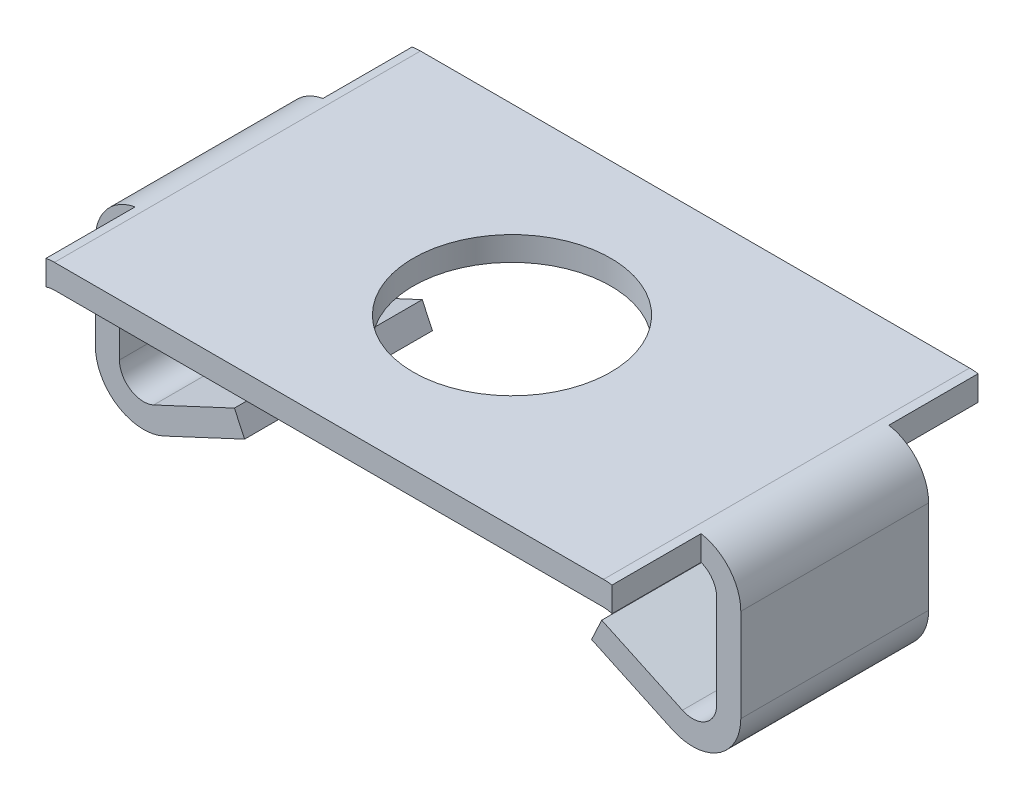
ISO-10303-21;
HEADER;
FILE_DESCRIPTION(('STEP AP214'),'2;1');
FILE_NAME('part.step','',(''),(''),'','','');
FILE_SCHEMA(('AUTOMOTIVE_DESIGN { 1 0 10303 214 1 1 1 1 }'));
ENDSEC;
DATA;
#1=APPLICATION_CONTEXT('core data for automotive mechanical design processes');
#2=APPLICATION_PROTOCOL_DEFINITION('international standard','automotive_design',2000,#1);
#3=PRODUCT_CONTEXT('',#1,'mechanical');
#4=PRODUCT('Part','Part','',(#3));
#5=PRODUCT_RELATED_PRODUCT_CATEGORY('part','',(#4));
#6=PRODUCT_DEFINITION_FORMATION('','',#4);
#7=PRODUCT_DEFINITION_CONTEXT('part definition',#1,'design');
#8=PRODUCT_DEFINITION('design','',#6,#7);
#9=PRODUCT_DEFINITION_SHAPE('','',#8);
#10=(LENGTH_UNIT() NAMED_UNIT(*) SI_UNIT(.MILLI.,.METRE.));
#11=(NAMED_UNIT(*) PLANE_ANGLE_UNIT() SI_UNIT($,.RADIAN.));
#12=(NAMED_UNIT(*) SI_UNIT($,.STERADIAN.) SOLID_ANGLE_UNIT());
#13=UNCERTAINTY_MEASURE_WITH_UNIT(LENGTH_MEASURE(1.E-05),#10,'distance_accuracy_value','');
#14=(GEOMETRIC_REPRESENTATION_CONTEXT(3) GLOBAL_UNCERTAINTY_ASSIGNED_CONTEXT((#13)) GLOBAL_UNIT_ASSIGNED_CONTEXT((#10,
#11,#12)) REPRESENTATION_CONTEXT('',''));
#15=CARTESIAN_POINT('',(0.,0.,0.));
#16=DIRECTION('',(0.,0.,1.));
#17=DIRECTION('',(1.,0.,0.));
#18=AXIS2_PLACEMENT_3D('',#15,#16,#17);
#19=CARTESIAN_POINT('',(-11.5447485690227,-5.86062884576497,-7.6));
#20=DIRECTION('',(0.,0.,1.));
#21=DIRECTION('',(1.,0.,0.));
#22=AXIS2_PLACEMENT_3D('',#19,#20,#21);
#23=PLANE('',#22);
#24=DIRECTION('',(0.,1.,0.));
#25=VECTOR('',#24,1.);
#26=CARTESIAN_POINT('',(-11.8947485690229,-3.29206444648551,-7.6));
#27=LINE('',#26,#25);
#28=CARTESIAN_POINT('',(-11.8947485690229,-1.06325030024036,-7.6));
#29=VERTEX_POINT('',#28);
#30=CARTESIAN_POINT('',(-11.8947485690229,-0.0308631332485367,-7.6));
#31=VERTEX_POINT('',#30);
#32=EDGE_CURVE('E219',#29,#31,#27,.T.);
#33=ORIENTED_EDGE('',*,*,#32,.T.);
#34=CARTESIAN_POINT('',(-11.5447485690226,-1.99999999999996,-7.6));
#35=DIRECTION('',(0.,0.,1.));
#36=DIRECTION('',(1.,0.,0.));
#37=AXIS2_PLACEMENT_3D('',#34,#35,#36);
#38=CIRCLE('',#37,1.99999999999996);
#39=CARTESIAN_POINT('',(-11.5447485690225,0.,-7.6));
#40=VERTEX_POINT('',#39);
#41=EDGE_CURVE('E262',#40,#31,#38,.T.);
#42=ORIENTED_EDGE('',*,*,#41,.F.);
#43=DIRECTION('',(-1.,0.,0.));
#44=VECTOR('',#43,1.);
#45=CARTESIAN_POINT('',(-11.5447485690225,0.,-7.6));
#46=LINE('',#45,#44);
#47=CARTESIAN_POINT('',(11.2552514309768,0.,-7.6));
#48=VERTEX_POINT('',#47);
#49=EDGE_CURVE('E260',#48,#40,#46,.T.);
#50=ORIENTED_EDGE('',*,*,#49,.F.);
#51=CARTESIAN_POINT('',(11.2552514309768,-1.99999999999996,-7.6));
#52=DIRECTION('',(0.,0.,1.));
#53=DIRECTION('',(1.,0.,0.));
#54=AXIS2_PLACEMENT_3D('',#51,#52,#53);
#55=CIRCLE('',#54,1.99999999999996);
#56=CARTESIAN_POINT('',(11.6052514309771,-0.0308631332485367,-7.6));
#57=VERTEX_POINT('',#56);
#58=EDGE_CURVE('E258',#57,#48,#55,.T.);
#59=ORIENTED_EDGE('',*,*,#58,.F.);
#60=DIRECTION('',(0.,1.,0.));
#61=VECTOR('',#60,1.);
#62=CARTESIAN_POINT('',(11.6052514309771,-5.86062884576497,-7.6));
#63=LINE('',#62,#61);
#64=CARTESIAN_POINT('',(11.6052514309771,-1.06325030024036,-7.6));
#65=VERTEX_POINT('',#64);
#66=EDGE_CURVE('E331',#65,#57,#63,.T.);
#67=ORIENTED_EDGE('',*,*,#66,.F.);
#68=CARTESIAN_POINT('',(11.2552514309768,-1.99999999999996,-7.6));
#69=DIRECTION('',(0.,0.,-1.));
#70=DIRECTION('',(1.,0.,0.));
#71=AXIS2_PLACEMENT_3D('',#68,#69,#70);
#72=CIRCLE('',#71,0.999999999999962);
#73=CARTESIAN_POINT('',(11.2552514309768,-1.,-7.6));
#74=VERTEX_POINT('',#73);
#75=EDGE_CURVE('E248',#74,#65,#72,.T.);
#76=ORIENTED_EDGE('',*,*,#75,.F.);
#77=DIRECTION('',(1.,0.,0.));
#78=VECTOR('',#77,1.);
#79=CARTESIAN_POINT('',(-11.5447485690225,-1.,-7.6));
#80=LINE('',#79,#78);
#81=CARTESIAN_POINT('',(-11.5447485690225,-1.,-7.6));
#82=VERTEX_POINT('',#81);
#83=EDGE_CURVE('E245',#82,#74,#80,.T.);
#84=ORIENTED_EDGE('',*,*,#83,.F.);
#85=CARTESIAN_POINT('',(-11.5447485690226,-1.99999999999996,-7.6));
#86=DIRECTION('',(0.,0.,-1.));
#87=DIRECTION('',(1.,0.,0.));
#88=AXIS2_PLACEMENT_3D('',#85,#86,#87);
#89=CIRCLE('',#88,0.999999999999962);
#90=EDGE_CURVE('E237',#29,#82,#89,.T.);
#91=ORIENTED_EDGE('',*,*,#90,.F.);
#92=EDGE_LOOP('',(#33,#42,#50,#59,#67,#76,#84,#91));
#93=FACE_BOUND('',#92,.T.);
#94=ADVANCED_FACE('F35',(#93),#23,.F.);
#95=CARTESIAN_POINT('',(-7.34818396302703,-6.11049446997185,7.6));
#96=DIRECTION('',(-0.906307787036611,-0.422618261740783,0.));
#97=DIRECTION('',(0.422618261740783,-0.906307787036611,0.));
#98=AXIS2_PLACEMENT_3D('',#95,#96,#97);
#99=PLANE('',#98);
#100=DIRECTION('',(0.422618261740783,-0.906307787036611,0.));
#101=VECTOR('',#100,1.);
#102=CARTESIAN_POINT('',(-7.34818396302703,-6.11049446997185,-3.9));
#103=LINE('',#102,#101);
#104=CARTESIAN_POINT('',(-7.77080222476784,-5.20418668293519,-3.9));
#105=VERTEX_POINT('',#104);
#106=CARTESIAN_POINT('',(-7.34818396302703,-6.11049446997185,-3.9));
#107=VERTEX_POINT('',#106);
#108=EDGE_CURVE('E457',#105,#107,#103,.T.);
#109=ORIENTED_EDGE('',*,*,#108,.F.);
#110=DIRECTION('',(0.,0.,-1.));
#111=VECTOR('',#110,1.);
#112=CARTESIAN_POINT('',(-7.77080222476784,-5.20418668293519,7.6));
#113=LINE('',#112,#111);
#114=CARTESIAN_POINT('',(-7.77080222476784,-5.20418668293519,3.9));
#115=VERTEX_POINT('',#114);
#116=EDGE_CURVE('E320',#115,#105,#113,.T.);
#117=ORIENTED_EDGE('',*,*,#116,.F.);
#118=DIRECTION('',(-0.422618261740783,0.906307787036611,0.));
#119=VECTOR('',#118,1.);
#120=CARTESIAN_POINT('',(-7.34818396302703,-6.11049446997185,3.9));
#121=LINE('',#120,#119);
#122=CARTESIAN_POINT('',(-7.34818396302703,-6.11049446997185,3.9));
#123=VERTEX_POINT('',#122);
#124=EDGE_CURVE('E392',#123,#115,#121,.T.);
#125=ORIENTED_EDGE('',*,*,#124,.F.);
#126=DIRECTION('',(0.,0.,-1.));
#127=VECTOR('',#126,1.);
#128=CARTESIAN_POINT('',(-7.34818396302703,-6.11049446997185,7.6));
#129=LINE('',#128,#127);
#130=EDGE_CURVE('E265',#123,#107,#129,.T.);
#131=ORIENTED_EDGE('',*,*,#130,.T.);
#132=EDGE_LOOP('',(#109,#117,#125,#131));
#133=FACE_BOUND('',#132,.T.);
#134=ADVANCED_FACE('F37',(#133),#99,.F.);
#135=CARTESIAN_POINT('',(-7.77080222476784,-5.20418668293519,7.6));
#136=DIRECTION('',(0.42261826174072,-0.906307787036641,0.));
#137=DIRECTION('',(0.906307787036641,0.42261826174072,0.));
#138=AXIS2_PLACEMENT_3D('',#135,#136,#137);
#139=PLANE('',#138);
#140=DIRECTION('',(0.906307787036641,0.42261826174072,0.));
#141=VECTOR('',#140,1.);
#142=CARTESIAN_POINT('',(-7.77080222476784,-5.20418668293519,-3.9));
#143=LINE('',#142,#141);
#144=CARTESIAN_POINT('',(-11.1221303072822,-6.76693663280161,-3.9));
#145=VERTEX_POINT('',#144);
#146=EDGE_CURVE('E453',#145,#105,#143,.T.);
#147=ORIENTED_EDGE('',*,*,#146,.F.);
#148=DIRECTION('',(0.,0.,-1.));
#149=VECTOR('',#148,1.);
#150=CARTESIAN_POINT('',(-11.1221303072822,-6.76693663280165,7.6));
#151=LINE('',#150,#149);
#152=CARTESIAN_POINT('',(-11.1221303072822,-6.76693663280161,3.9));
#153=VERTEX_POINT('',#152);
#154=EDGE_CURVE('E317',#153,#145,#151,.T.);
#155=ORIENTED_EDGE('',*,*,#154,.F.);
#156=DIRECTION('',(-0.906307787036641,-0.42261826174072,0.));
#157=VECTOR('',#156,1.);
#158=CARTESIAN_POINT('',(-7.77080222476784,-5.20418668293519,3.9));
#159=LINE('',#158,#157);
#160=EDGE_CURVE('E394',#115,#153,#159,.T.);
#161=ORIENTED_EDGE('',*,*,#160,.F.);
#162=ORIENTED_EDGE('',*,*,#116,.T.);
#163=EDGE_LOOP('',(#147,#155,#161,#162));
#164=FACE_BOUND('',#163,.T.);
#165=ADVANCED_FACE('F491',(#164),#139,.F.);
#166=CARTESIAN_POINT('',(-11.5447485690227,-5.86062884576497,7.6));
#167=DIRECTION('',(0.,0.,-1.));
#168=DIRECTION('',(-1.,0.,0.));
#169=AXIS2_PLACEMENT_3D('',#166,#167,#168);
#170=CYLINDRICAL_SURFACE('',#169,0.999999999999974);
#171=CARTESIAN_POINT('',(-11.5447485690227,-5.86062884576497,-3.9));
#172=DIRECTION('',(0.,0.,-1.));
#173=DIRECTION('',(-1.,0.,0.));
#174=AXIS2_PLACEMENT_3D('',#171,#172,#173);
#175=CIRCLE('',#174,0.999999999999974);
#176=CARTESIAN_POINT('',(-12.5447485690227,-5.86062884576497,-3.9));
#177=VERTEX_POINT('',#176);
#178=EDGE_CURVE('E450',#177,#145,#175,.F.);
#179=ORIENTED_EDGE('',*,*,#178,.F.);
#180=DIRECTION('',(0.,0.,-1.));
#181=VECTOR('',#180,1.);
#182=CARTESIAN_POINT('',(-12.5447485690227,-5.86062884576495,7.6));
#183=LINE('',#182,#181);
#184=CARTESIAN_POINT('',(-12.5447485690227,-5.86062884576495,3.9));
#185=VERTEX_POINT('',#184);
#186=EDGE_CURVE('E314',#185,#177,#183,.T.);
#187=ORIENTED_EDGE('',*,*,#186,.F.);
#188=CARTESIAN_POINT('',(-11.5447485690227,-5.86062884576497,3.9));
#189=DIRECTION('',(0.,0.,1.));
#190=DIRECTION('',(1.,0.,0.));
#191=AXIS2_PLACEMENT_3D('',#188,#189,#190);
#192=CIRCLE('',#191,0.999999999999974);
#193=EDGE_CURVE('E396',#153,#185,#192,.F.);
#194=ORIENTED_EDGE('',*,*,#193,.F.);
#195=ORIENTED_EDGE('',*,*,#154,.T.);
#196=EDGE_LOOP('',(#179,#187,#194,#195));
#197=FACE_BOUND('',#196,.T.);
#198=ADVANCED_FACE('F522',(#197),#170,.F.);
#199=CARTESIAN_POINT('',(-12.5447485690227,-5.86062884576495,7.6));
#200=DIRECTION('',(-1.,0.,0.));
#201=DIRECTION('',(0.,-1.,0.));
#202=AXIS2_PLACEMENT_3D('',#199,#200,#201);
#203=PLANE('',#202);
#204=DIRECTION('',(0.,-1.,0.));
#205=VECTOR('',#204,1.);
#206=CARTESIAN_POINT('',(-12.5447485690227,-5.86062884576495,-3.9));
#207=LINE('',#206,#205);
#208=CARTESIAN_POINT('',(-12.5447485690225,-2.,-3.9));
#209=VERTEX_POINT('',#208);
#210=EDGE_CURVE('E448',#209,#177,#207,.T.);
#211=ORIENTED_EDGE('',*,*,#210,.F.);
#212=DIRECTION('',(0.,0.,-1.));
#213=VECTOR('',#212,1.);
#214=CARTESIAN_POINT('',(-12.5447485690225,-2.,7.6));
#215=LINE('',#214,#213);
#216=CARTESIAN_POINT('',(-12.5447485690225,-2.,3.9));
#217=VERTEX_POINT('',#216);
#218=EDGE_CURVE('E312',#217,#209,#215,.T.);
#219=ORIENTED_EDGE('',*,*,#218,.F.);
#220=DIRECTION('',(0.,1.,0.));
#221=VECTOR('',#220,1.);
#222=CARTESIAN_POINT('',(-12.5447485690227,-5.86062884576495,3.9));
#223=LINE('',#222,#221);
#224=EDGE_CURVE('E398',#185,#217,#223,.T.);
#225=ORIENTED_EDGE('',*,*,#224,.F.);
#226=ORIENTED_EDGE('',*,*,#186,.T.);
#227=EDGE_LOOP('',(#211,#219,#225,#226));
#228=FACE_BOUND('',#227,.T.);
#229=ADVANCED_FACE('F446',(#228),#203,.F.);
#230=CARTESIAN_POINT('',(-13.5447485690227,-5.86062884576495,7.6));
#231=DIRECTION('',(1.,0.,0.));
#232=DIRECTION('',(0.,1.,0.));
#233=AXIS2_PLACEMENT_3D('',#230,#231,#232);
#234=PLANE('',#233);
#235=DIRECTION('',(0.,1.,0.));
#236=VECTOR('',#235,1.);
#237=CARTESIAN_POINT('',(-13.5447485690227,-5.86062884576495,-3.9));
#238=LINE('',#237,#236);
#239=CARTESIAN_POINT('',(-13.5447485690227,-5.86062884576495,-3.9));
#240=VERTEX_POINT('',#239);
#241=CARTESIAN_POINT('',(-13.5447485690225,-2.,-3.9));
#242=VERTEX_POINT('',#241);
#243=EDGE_CURVE('E50',#240,#242,#238,.T.);
#244=ORIENTED_EDGE('',*,*,#243,.F.);
#245=DIRECTION('',(0.,0.,-1.));
#246=VECTOR('',#245,1.);
#247=CARTESIAN_POINT('',(-13.5447485690227,-5.86062884576495,7.6));
#248=LINE('',#247,#246);
#249=CARTESIAN_POINT('',(-13.5447485690227,-5.86062884576495,3.9));
#250=VERTEX_POINT('',#249);
#251=EDGE_CURVE('E271',#250,#240,#248,.T.);
#252=ORIENTED_EDGE('',*,*,#251,.F.);
#253=DIRECTION('',(0.,-1.,0.));
#254=VECTOR('',#253,1.);
#255=CARTESIAN_POINT('',(-13.5447485690227,-5.86062884576495,3.9));
#256=LINE('',#255,#254);
#257=CARTESIAN_POINT('',(-13.5447485690225,-2.,3.9));
#258=VERTEX_POINT('',#257);
#259=EDGE_CURVE('E388',#258,#250,#256,.T.);
#260=ORIENTED_EDGE('',*,*,#259,.F.);
#261=DIRECTION('',(0.,0.,-1.));
#262=VECTOR('',#261,1.);
#263=CARTESIAN_POINT('',(-13.5447485690225,-2.,7.6));
#264=LINE('',#263,#262);
#265=EDGE_CURVE('E274',#258,#242,#264,.T.);
#266=ORIENTED_EDGE('',*,*,#265,.T.);
#267=EDGE_LOOP('',(#244,#252,#260,#266));
#268=FACE_BOUND('',#267,.T.);
#269=ADVANCED_FACE('F502',(#268),#234,.F.);
#270=CARTESIAN_POINT('',(-11.5447485690227,-5.86062884576497,7.6));
#271=DIRECTION('',(0.,0.,-1.));
#272=DIRECTION('',(-1.,0.,0.));
#273=AXIS2_PLACEMENT_3D('',#270,#271,#272);
#274=CYLINDRICAL_SURFACE('',#273,2.);
#275=CARTESIAN_POINT('',(-11.5447485690227,-5.86062884576497,-3.9));
#276=DIRECTION('',(0.,0.,-1.));
#277=DIRECTION('',(-1.,0.,0.));
#278=AXIS2_PLACEMENT_3D('',#275,#276,#277);
#279=CIRCLE('',#278,2.);
#280=CARTESIAN_POINT('',(-10.6995120455414,-7.67324441983828,-3.9));
#281=VERTEX_POINT('',#280);
#282=EDGE_CURVE('E461',#281,#240,#279,.T.);
#283=ORIENTED_EDGE('',*,*,#282,.F.);
#284=DIRECTION('',(0.,0.,-1.));
#285=VECTOR('',#284,1.);
#286=CARTESIAN_POINT('',(-10.6995120455414,-7.67324441983828,7.6));
#287=LINE('',#286,#285);
#288=CARTESIAN_POINT('',(-10.6995120455414,-7.67324441983828,3.9));
#289=VERTEX_POINT('',#288);
#290=EDGE_CURVE('E268',#289,#281,#287,.T.);
#291=ORIENTED_EDGE('',*,*,#290,.F.);
#292=CARTESIAN_POINT('',(-11.5447485690227,-5.86062884576497,3.9));
#293=DIRECTION('',(0.,0.,1.));
#294=DIRECTION('',(1.,0.,0.));
#295=AXIS2_PLACEMENT_3D('',#292,#293,#294);
#296=CIRCLE('',#295,2.);
#297=EDGE_CURVE('E386',#250,#289,#296,.T.);
#298=ORIENTED_EDGE('',*,*,#297,.F.);
#299=ORIENTED_EDGE('',*,*,#251,.T.);
#300=EDGE_LOOP('',(#283,#291,#298,#299));
#301=FACE_BOUND('',#300,.T.);
#302=ADVANCED_FACE('F498',(#301),#274,.T.);
#303=CARTESIAN_POINT('',(-7.34818396302703,-6.11049446997185,7.6));
#304=DIRECTION('',(-0.42261826174072,0.90630778703664,0.));
#305=DIRECTION('',(-0.906307787036641,-0.42261826174072,0.));
#306=AXIS2_PLACEMENT_3D('',#303,#304,#305);
#307=PLANE('',#306);
#308=DIRECTION('',(-0.906307787036641,-0.42261826174072,0.));
#309=VECTOR('',#308,1.);
#310=CARTESIAN_POINT('',(-7.34818396302703,-6.11049446997185,-3.9));
#311=LINE('',#310,#309);
#312=EDGE_CURVE('E459',#107,#281,#311,.T.);
#313=ORIENTED_EDGE('',*,*,#312,.F.);
#314=ORIENTED_EDGE('',*,*,#130,.F.);
#315=DIRECTION('',(0.906307787036641,0.42261826174072,0.));
#316=VECTOR('',#315,1.);
#317=CARTESIAN_POINT('',(-7.34818396302703,-6.11049446997185,3.9));
#318=LINE('',#317,#316);
#319=EDGE_CURVE('E329',#289,#123,#318,.T.);
#320=ORIENTED_EDGE('',*,*,#319,.F.);
#321=ORIENTED_EDGE('',*,*,#290,.T.);
#322=EDGE_LOOP('',(#313,#314,#320,#321));
#323=FACE_BOUND('',#322,.T.);
#324=ADVANCED_FACE('F495',(#323),#307,.F.);
#325=CARTESIAN_POINT('',(-11.5447485690226,-1.99999999999996,7.6));
#326=DIRECTION('',(0.,0.,-1.));
#327=DIRECTION('',(-1.,0.,0.));
#328=AXIS2_PLACEMENT_3D('',#325,#326,#327);
#329=CYLINDRICAL_SURFACE('',#328,0.999999999999962);
#330=DIRECTION('',(0.,0.,-1.));
#331=VECTOR('',#330,1.);
#332=CARTESIAN_POINT('',(-11.8947485690229,-1.06325030024036,7.6));
#333=LINE('',#332,#331);
#334=CARTESIAN_POINT('',(-11.8947485690229,-1.06325030024036,-3.9));
#335=VERTEX_POINT('',#334);
#336=EDGE_CURVE('E223',#29,#335,#333,.F.);
#337=ORIENTED_EDGE('',*,*,#336,.F.);
#338=ORIENTED_EDGE('',*,*,#90,.T.);
#339=DIRECTION('',(0.,0.,-1.));
#340=VECTOR('',#339,1.);
#341=CARTESIAN_POINT('',(-11.5447485690225,-1.,7.6));
#342=LINE('',#341,#340);
#343=CARTESIAN_POINT('',(-11.5447485690225,-1.,7.6));
#344=VERTEX_POINT('',#343);
#345=EDGE_CURVE('E310',#344,#82,#342,.T.);
#346=ORIENTED_EDGE('',*,*,#345,.F.);
#347=CARTESIAN_POINT('',(-11.5447485690226,-1.99999999999996,7.6));
#348=DIRECTION('',(0.,0.,-1.));
#349=DIRECTION('',(1.,0.,0.));
#350=AXIS2_PLACEMENT_3D('',#347,#348,#349);
#351=CIRCLE('',#350,0.999999999999962);
#352=CARTESIAN_POINT('',(-11.8947485690229,-1.06325030024036,7.6));
#353=VERTEX_POINT('',#352);
#354=EDGE_CURVE('E264',#353,#344,#351,.T.);
#355=ORIENTED_EDGE('',*,*,#354,.F.);
#356=DIRECTION('',(0.,0.,-1.));
#357=VECTOR('',#356,1.);
#358=CARTESIAN_POINT('',(-11.8947485690229,-1.06325030024036,7.6));
#359=LINE('',#358,#357);
#360=CARTESIAN_POINT('',(-11.8947485690229,-1.06325030024036,3.9));
#361=VERTEX_POINT('',#360);
#362=EDGE_CURVE('E383',#353,#361,#359,.T.);
#363=ORIENTED_EDGE('',*,*,#362,.T.);
#364=CARTESIAN_POINT('',(-11.5447485690226,-1.99999999999996,3.9));
#365=DIRECTION('',(0.,0.,1.));
#366=DIRECTION('',(1.,0.,0.));
#367=AXIS2_PLACEMENT_3D('',#364,#365,#366);
#368=CIRCLE('',#367,0.999999999999962);
#369=EDGE_CURVE('E400',#217,#361,#368,.F.);
#370=ORIENTED_EDGE('',*,*,#369,.F.);
#371=ORIENTED_EDGE('',*,*,#218,.T.);
#372=CARTESIAN_POINT('',(-11.5447485690226,-1.99999999999996,-3.9));
#373=DIRECTION('',(0.,0.,-1.));
#374=DIRECTION('',(-1.,0.,0.));
#375=AXIS2_PLACEMENT_3D('',#372,#373,#374);
#376=CIRCLE('',#375,0.999999999999962);
#377=EDGE_CURVE('E240',#335,#209,#376,.F.);
#378=ORIENTED_EDGE('',*,*,#377,.F.);
#379=EDGE_LOOP('',(#337,#338,#346,#355,#363,#370,#371,#378));
#380=FACE_BOUND('',#379,.T.);
#381=ADVANCED_FACE('F235',(#380),#329,.F.);
#382=CARTESIAN_POINT('',(-11.5447485690226,-1.99999999999996,7.6));
#383=DIRECTION('',(0.,0.,-1.));
#384=DIRECTION('',(-1.,0.,0.));
#385=AXIS2_PLACEMENT_3D('',#382,#383,#384);
#386=CYLINDRICAL_SURFACE('',#385,1.99999999999996);
#387=DIRECTION('',(0.,0.,-1.));
#388=VECTOR('',#387,1.);
#389=CARTESIAN_POINT('',(-11.8947485690229,-0.0308631332485371,7.6));
#390=LINE('',#389,#388);
#391=CARTESIAN_POINT('',(-11.8947485690229,-0.0308631332485367,-3.9));
#392=VERTEX_POINT('',#391);
#393=EDGE_CURVE('E11',#392,#31,#390,.T.);
#394=ORIENTED_EDGE('',*,*,#393,.F.);
#395=CARTESIAN_POINT('',(-11.5447485690226,-1.99999999999996,-3.9));
#396=DIRECTION('',(0.,0.,-1.));
#397=DIRECTION('',(-1.,0.,0.));
#398=AXIS2_PLACEMENT_3D('',#395,#396,#397);
#399=CIRCLE('',#398,1.99999999999996);
#400=EDGE_CURVE('E43',#242,#392,#399,.T.);
#401=ORIENTED_EDGE('',*,*,#400,.F.);
#402=ORIENTED_EDGE('',*,*,#265,.F.);
#403=CARTESIAN_POINT('',(-11.5447485690226,-1.99999999999996,3.9));
#404=DIRECTION('',(0.,0.,1.));
#405=DIRECTION('',(1.,0.,0.));
#406=AXIS2_PLACEMENT_3D('',#403,#404,#405);
#407=CIRCLE('',#406,1.99999999999996);
#408=CARTESIAN_POINT('',(-11.8947485690229,-0.0308631332485367,3.9));
#409=VERTEX_POINT('',#408);
#410=EDGE_CURVE('E390',#409,#258,#407,.T.);
#411=ORIENTED_EDGE('',*,*,#410,.F.);
#412=DIRECTION('',(0.,0.,-1.));
#413=VECTOR('',#412,1.);
#414=CARTESIAN_POINT('',(-11.8947485690229,-0.0308631332485371,7.6));
#415=LINE('',#414,#413);
#416=CARTESIAN_POINT('',(-11.8947485690229,-0.0308631332485367,7.6));
#417=VERTEX_POINT('',#416);
#418=EDGE_CURVE('E380',#409,#417,#415,.F.);
#419=ORIENTED_EDGE('',*,*,#418,.T.);
#420=CARTESIAN_POINT('',(-11.5447485690226,-1.99999999999996,7.6));
#421=DIRECTION('',(0.,0.,1.));
#422=DIRECTION('',(1.,0.,0.));
#423=AXIS2_PLACEMENT_3D('',#420,#421,#422);
#424=CIRCLE('',#423,1.99999999999996);
#425=CARTESIAN_POINT('',(-11.5447485690225,0.,7.6));
#426=VERTEX_POINT('',#425);
#427=EDGE_CURVE('E253',#426,#417,#424,.T.);
#428=ORIENTED_EDGE('',*,*,#427,.F.);
#429=DIRECTION('',(0.,0.,-1.));
#430=VECTOR('',#429,1.);
#431=CARTESIAN_POINT('',(-11.5447485690225,0.,7.6));
#432=LINE('',#431,#430);
#433=EDGE_CURVE('E277',#426,#40,#432,.T.);
#434=ORIENTED_EDGE('',*,*,#433,.T.);
#435=ORIENTED_EDGE('',*,*,#41,.T.);
#436=EDGE_LOOP('',(#394,#401,#402,#411,#419,#428,#434,#435));
#437=FACE_BOUND('',#436,.T.);
#438=ADVANCED_FACE('F338',(#437),#386,.T.);
#439=CARTESIAN_POINT('',(12.2552514309768,-2.,7.6));
#440=DIRECTION('',(1.,0.,0.));
#441=DIRECTION('',(0.,1.,0.));
#442=AXIS2_PLACEMENT_3D('',#439,#440,#441);
#443=PLANE('',#442);
#444=DIRECTION('',(0.,1.,0.));
#445=VECTOR('',#444,1.);
#446=CARTESIAN_POINT('',(12.2552514309768,-2.,-3.9));
#447=LINE('',#446,#445);
#448=CARTESIAN_POINT('',(12.2552514309769,-5.86062884576495,-3.9));
#449=VERTEX_POINT('',#448);
#450=CARTESIAN_POINT('',(12.2552514309768,-2.,-3.9));
#451=VERTEX_POINT('',#450);
#452=EDGE_CURVE('E373',#449,#451,#447,.T.);
#453=ORIENTED_EDGE('',*,*,#452,.F.);
#454=DIRECTION('',(0.,0.,-1.));
#455=VECTOR('',#454,1.);
#456=CARTESIAN_POINT('',(12.2552514309769,-5.86062884576495,7.6));
#457=LINE('',#456,#455);
#458=CARTESIAN_POINT('',(12.2552514309769,-5.86062884576507,3.9));
#459=VERTEX_POINT('',#458);
#460=EDGE_CURVE('E301',#459,#449,#457,.T.);
#461=ORIENTED_EDGE('',*,*,#460,.F.);
#462=DIRECTION('',(0.,-1.,0.));
#463=VECTOR('',#462,1.);
#464=CARTESIAN_POINT('',(12.2552514309768,-2.,3.9));
#465=LINE('',#464,#463);
#466=CARTESIAN_POINT('',(12.2552514309768,-2.,3.9));
#467=VERTEX_POINT('',#466);
#468=EDGE_CURVE('E250',#467,#459,#465,.T.);
#469=ORIENTED_EDGE('',*,*,#468,.F.);
#470=DIRECTION('',(0.,0.,-1.));
#471=VECTOR('',#470,1.);
#472=CARTESIAN_POINT('',(12.2552514309768,-2.,7.6));
#473=LINE('',#472,#471);
#474=EDGE_CURVE('E304',#467,#451,#473,.T.);
#475=ORIENTED_EDGE('',*,*,#474,.T.);
#476=EDGE_LOOP('',(#453,#461,#469,#475));
#477=FACE_BOUND('',#476,.T.);
#478=ADVANCED_FACE('F507',(#477),#443,.F.);
#479=CARTESIAN_POINT('',(11.255251430977,-5.86062884576507,7.6));
#480=DIRECTION('',(0.,0.,-1.));
#481=DIRECTION('',(-1.,0.,0.));
#482=AXIS2_PLACEMENT_3D('',#479,#480,#481);
#483=CYLINDRICAL_SURFACE('',#482,0.999999999999913);
#484=CARTESIAN_POINT('',(11.255251430977,-5.86062884576507,-3.9));
#485=DIRECTION('',(0.,0.,-1.));
#486=DIRECTION('',(-1.,0.,0.));
#487=AXIS2_PLACEMENT_3D('',#484,#485,#486);
#488=CIRCLE('',#487,0.999999999999913);
#489=CARTESIAN_POINT('',(10.8326331692364,-6.76693663280162,-3.9));
#490=VERTEX_POINT('',#489);
#491=EDGE_CURVE('E371',#490,#449,#488,.F.);
#492=ORIENTED_EDGE('',*,*,#491,.F.);
#493=DIRECTION('',(0.,0.,-1.));
#494=VECTOR('',#493,1.);
#495=CARTESIAN_POINT('',(10.8326331692364,-6.76693663280162,7.6));
#496=LINE('',#495,#494);
#497=CARTESIAN_POINT('',(10.8326331692364,-6.76693663280162,3.9));
#498=VERTEX_POINT('',#497);
#499=EDGE_CURVE('E298',#498,#490,#496,.T.);
#500=ORIENTED_EDGE('',*,*,#499,.F.);
#501=CARTESIAN_POINT('',(11.255251430977,-5.86062884576507,3.9));
#502=DIRECTION('',(0.,0.,1.));
#503=DIRECTION('',(1.,0.,0.));
#504=AXIS2_PLACEMENT_3D('',#501,#502,#503);
#505=CIRCLE('',#504,0.999999999999913);
#506=EDGE_CURVE('E420',#459,#498,#505,.F.);
#507=ORIENTED_EDGE('',*,*,#506,.F.);
#508=ORIENTED_EDGE('',*,*,#460,.T.);
#509=EDGE_LOOP('',(#492,#500,#507,#508));
#510=FACE_BOUND('',#509,.T.);
#511=ADVANCED_FACE('F512',(#510),#483,.F.);
#512=CARTESIAN_POINT('',(10.8326331692364,-6.76693663280162,7.6));
#513=DIRECTION('',(-0.42261826174072,-0.906307787036641,0.));
#514=DIRECTION('',(0.906307787036641,-0.42261826174072,0.));
#515=AXIS2_PLACEMENT_3D('',#512,#513,#514);
#516=PLANE('',#515);
#517=DIRECTION('',(0.906307787036641,-0.42261826174072,0.));
#518=VECTOR('',#517,1.);
#519=CARTESIAN_POINT('',(10.8326331692364,-6.76693663280162,-3.9));
#520=LINE('',#519,#518);
#521=CARTESIAN_POINT('',(7.48130508672207,-5.20418668293519,-3.9));
#522=VERTEX_POINT('',#521);
#523=EDGE_CURVE('E369',#522,#490,#520,.T.);
#524=ORIENTED_EDGE('',*,*,#523,.F.);
#525=DIRECTION('',(0.,0.,-1.));
#526=VECTOR('',#525,1.);
#527=CARTESIAN_POINT('',(7.48130508672207,-5.20418668293519,7.6));
#528=LINE('',#527,#526);
#529=CARTESIAN_POINT('',(7.48130508672207,-5.20418668293519,3.9));
#530=VERTEX_POINT('',#529);
#531=EDGE_CURVE('E295',#530,#522,#528,.T.);
#532=ORIENTED_EDGE('',*,*,#531,.F.);
#533=DIRECTION('',(-0.906307787036641,0.42261826174072,0.));
#534=VECTOR('',#533,1.);
#535=CARTESIAN_POINT('',(10.8326331692364,-6.76693663280162,3.9));
#536=LINE('',#535,#534);
#537=EDGE_CURVE('E418',#498,#530,#536,.T.);
#538=ORIENTED_EDGE('',*,*,#537,.F.);
#539=ORIENTED_EDGE('',*,*,#499,.T.);
#540=EDGE_LOOP('',(#524,#532,#538,#539));
#541=FACE_BOUND('',#540,.T.);
#542=ADVANCED_FACE('F588',(#541),#516,.F.);
#543=CARTESIAN_POINT('',(7.48130508672207,-5.20418668293519,7.6));
#544=DIRECTION('',(0.906307787036611,-0.422618261740783,0.));
#545=DIRECTION('',(0.422618261740783,0.906307787036611,0.));
#546=AXIS2_PLACEMENT_3D('',#543,#544,#545);
#547=PLANE('',#546);
#548=DIRECTION('',(0.422618261740783,0.906307787036611,0.));
#549=VECTOR('',#548,1.);
#550=CARTESIAN_POINT('',(7.48130508672207,-5.20418668293519,-3.9));
#551=LINE('',#550,#549);
#552=CARTESIAN_POINT('',(7.05868682498127,-6.11049446997185,-3.9));
#553=VERTEX_POINT('',#552);
#554=EDGE_CURVE('E367',#553,#522,#551,.T.);
#555=ORIENTED_EDGE('',*,*,#554,.F.);
#556=DIRECTION('',(0.,0.,-1.));
#557=VECTOR('',#556,1.);
#558=CARTESIAN_POINT('',(7.05868682498126,-6.11049446997185,7.6));
#559=LINE('',#558,#557);
#560=CARTESIAN_POINT('',(7.05868682498127,-6.11049446997185,3.9));
#561=VERTEX_POINT('',#560);
#562=EDGE_CURVE('E292',#561,#553,#559,.T.);
#563=ORIENTED_EDGE('',*,*,#562,.F.);
#564=DIRECTION('',(-0.422618261740783,-0.906307787036611,0.));
#565=VECTOR('',#564,1.);
#566=CARTESIAN_POINT('',(7.48130508672207,-5.20418668293519,3.9));
#567=LINE('',#566,#565);
#568=EDGE_CURVE('E416',#530,#561,#567,.T.);
#569=ORIENTED_EDGE('',*,*,#568,.F.);
#570=ORIENTED_EDGE('',*,*,#531,.T.);
#571=EDGE_LOOP('',(#555,#563,#569,#570));
#572=FACE_BOUND('',#571,.T.);
#573=ADVANCED_FACE('F598',(#572),#547,.F.);
#574=CARTESIAN_POINT('',(10.4100149074956,-7.67324441983828,7.6));
#575=DIRECTION('',(0.42261826174072,0.90630778703664,0.));
#576=DIRECTION('',(-0.906307787036641,0.42261826174072,0.));
#577=AXIS2_PLACEMENT_3D('',#574,#575,#576);
#578=PLANE('',#577);
#579=DIRECTION('',(-0.906307787036641,0.42261826174072,0.));
#580=VECTOR('',#579,1.);
#581=CARTESIAN_POINT('',(10.4100149074956,-7.67324441983828,-3.9));
#582=LINE('',#581,#580);
#583=CARTESIAN_POINT('',(10.4100149074956,-7.67324441983828,-3.9));
#584=VERTEX_POINT('',#583);
#585=EDGE_CURVE('E365',#584,#553,#582,.T.);
#586=ORIENTED_EDGE('',*,*,#585,.F.);
#587=DIRECTION('',(0.,0.,-1.));
#588=VECTOR('',#587,1.);
#589=CARTESIAN_POINT('',(10.4100149074956,-7.67324441983828,7.6));
#590=LINE('',#589,#588);
#591=CARTESIAN_POINT('',(10.4100149074956,-7.67324441983828,3.9));
#592=VERTEX_POINT('',#591);
#593=EDGE_CURVE('E289',#592,#584,#590,.T.);
#594=ORIENTED_EDGE('',*,*,#593,.F.);
#595=DIRECTION('',(0.906307787036641,-0.42261826174072,0.));
#596=VECTOR('',#595,1.);
#597=CARTESIAN_POINT('',(10.4100149074956,-7.67324441983828,3.9));
#598=LINE('',#597,#596);
#599=EDGE_CURVE('E414',#561,#592,#598,.T.);
#600=ORIENTED_EDGE('',*,*,#599,.F.);
#601=ORIENTED_EDGE('',*,*,#562,.T.);
#602=EDGE_LOOP('',(#586,#594,#600,#601));
#603=FACE_BOUND('',#602,.T.);
#604=ADVANCED_FACE('F608',(#603),#578,.F.);
#605=CARTESIAN_POINT('',(11.255251430977,-5.86062884576507,7.6));
#606=DIRECTION('',(0.,0.,-1.));
#607=DIRECTION('',(-1.,0.,0.));
#608=AXIS2_PLACEMENT_3D('',#605,#606,#607);
#609=CYLINDRICAL_SURFACE('',#608,1.99999999999994);
#610=CARTESIAN_POINT('',(11.255251430977,-5.86062884576507,-3.9));
#611=DIRECTION('',(0.,0.,-1.));
#612=DIRECTION('',(-1.,0.,0.));
#613=AXIS2_PLACEMENT_3D('',#610,#611,#612);
#614=CIRCLE('',#613,1.99999999999994);
#615=CARTESIAN_POINT('',(13.255251430977,-5.86062884576495,-3.9));
#616=VERTEX_POINT('',#615);
#617=EDGE_CURVE('E363',#616,#584,#614,.T.);
#618=ORIENTED_EDGE('',*,*,#617,.F.);
#619=DIRECTION('',(0.,0.,-1.));
#620=VECTOR('',#619,1.);
#621=CARTESIAN_POINT('',(13.255251430977,-5.86062884576495,7.6));
#622=LINE('',#621,#620);
#623=CARTESIAN_POINT('',(13.255251430977,-5.86062884576495,3.9));
#624=VERTEX_POINT('',#623);
#625=EDGE_CURVE('E286',#624,#616,#622,.T.);
#626=ORIENTED_EDGE('',*,*,#625,.F.);
#627=CARTESIAN_POINT('',(11.255251430977,-5.86062884576507,3.9));
#628=DIRECTION('',(0.,0.,1.));
#629=DIRECTION('',(1.,0.,0.));
#630=AXIS2_PLACEMENT_3D('',#627,#628,#629);
#631=CIRCLE('',#630,1.99999999999994);
#632=EDGE_CURVE('E412',#592,#624,#631,.T.);
#633=ORIENTED_EDGE('',*,*,#632,.F.);
#634=ORIENTED_EDGE('',*,*,#593,.T.);
#635=EDGE_LOOP('',(#618,#626,#633,#634));
#636=FACE_BOUND('',#635,.T.);
#637=ADVANCED_FACE('F618',(#636),#609,.T.);
#638=CARTESIAN_POINT('',(13.2552514309768,-2.,7.6));
#639=DIRECTION('',(-1.,0.,0.));
#640=DIRECTION('',(0.,-1.,0.));
#641=AXIS2_PLACEMENT_3D('',#638,#639,#640);
#642=PLANE('',#641);
#643=DIRECTION('',(0.,-1.,0.));
#644=VECTOR('',#643,1.);
#645=CARTESIAN_POINT('',(13.2552514309768,-2.,-3.9));
#646=LINE('',#645,#644);
#647=CARTESIAN_POINT('',(13.2552514309768,-2.,-3.9));
#648=VERTEX_POINT('',#647);
#649=EDGE_CURVE('E358',#648,#616,#646,.T.);
#650=ORIENTED_EDGE('',*,*,#649,.F.);
#651=DIRECTION('',(0.,0.,-1.));
#652=VECTOR('',#651,1.);
#653=CARTESIAN_POINT('',(13.2552514309768,-2.,7.6));
#654=LINE('',#653,#652);
#655=CARTESIAN_POINT('',(13.2552514309768,-1.99999999999996,3.9));
#656=VERTEX_POINT('',#655);
#657=EDGE_CURVE('E283',#656,#648,#654,.T.);
#658=ORIENTED_EDGE('',*,*,#657,.F.);
#659=DIRECTION('',(0.,1.,0.));
#660=VECTOR('',#659,1.);
#661=CARTESIAN_POINT('',(13.2552514309768,-2.,3.9));
#662=LINE('',#661,#660);
#663=EDGE_CURVE('E410',#624,#656,#662,.T.);
#664=ORIENTED_EDGE('',*,*,#663,.F.);
#665=ORIENTED_EDGE('',*,*,#625,.T.);
#666=EDGE_LOOP('',(#650,#658,#664,#665));
#667=FACE_BOUND('',#666,.T.);
#668=ADVANCED_FACE('F628',(#667),#642,.F.);
#669=CARTESIAN_POINT('',(11.2552514309768,-1.99999999999996,7.6));
#670=DIRECTION('',(0.,0.,-1.));
#671=DIRECTION('',(-1.,0.,0.));
#672=AXIS2_PLACEMENT_3D('',#669,#670,#671);
#673=CYLINDRICAL_SURFACE('',#672,0.999999999999962);
#674=DIRECTION('',(0.,0.,-1.));
#675=VECTOR('',#674,1.);
#676=CARTESIAN_POINT('',(11.6052514309771,-1.06325030024036,7.6));
#677=LINE('',#676,#675);
#678=CARTESIAN_POINT('',(11.6052514309771,-1.06325030024036,-3.9));
#679=VERTEX_POINT('',#678);
#680=EDGE_CURVE('E58',#679,#65,#677,.T.);
#681=ORIENTED_EDGE('',*,*,#680,.F.);
#682=CARTESIAN_POINT('',(11.2552514309768,-1.99999999999996,-3.9));
#683=DIRECTION('',(0.,0.,-1.));
#684=DIRECTION('',(-1.,0.,0.));
#685=AXIS2_PLACEMENT_3D('',#682,#683,#684);
#686=CIRCLE('',#685,0.999999999999962);
#687=EDGE_CURVE('E375',#451,#679,#686,.F.);
#688=ORIENTED_EDGE('',*,*,#687,.F.);
#689=ORIENTED_EDGE('',*,*,#474,.F.);
#690=CARTESIAN_POINT('',(11.2552514309768,-1.99999999999996,3.9));
#691=DIRECTION('',(0.,0.,1.));
#692=DIRECTION('',(1.,0.,0.));
#693=AXIS2_PLACEMENT_3D('',#690,#691,#692);
#694=CIRCLE('',#693,0.999999999999962);
#695=CARTESIAN_POINT('',(11.6052514309771,-1.06325030024036,3.9));
#696=VERTEX_POINT('',#695);
#697=EDGE_CURVE('E246',#696,#467,#694,.F.);
#698=ORIENTED_EDGE('',*,*,#697,.F.);
#699=DIRECTION('',(0.,0.,-1.));
#700=VECTOR('',#699,1.);
#701=CARTESIAN_POINT('',(11.6052514309771,-1.06325030024036,7.6));
#702=LINE('',#701,#700);
#703=CARTESIAN_POINT('',(11.6052514309771,-1.06325030024036,7.6));
#704=VERTEX_POINT('',#703);
#705=EDGE_CURVE('E407',#696,#704,#702,.F.);
#706=ORIENTED_EDGE('',*,*,#705,.T.);
#707=CARTESIAN_POINT('',(11.2552514309768,-1.99999999999996,7.6));
#708=DIRECTION('',(0.,0.,-1.));
#709=DIRECTION('',(1.,0.,0.));
#710=AXIS2_PLACEMENT_3D('',#707,#708,#709);
#711=CIRCLE('',#710,0.999999999999962);
#712=CARTESIAN_POINT('',(11.2552514309768,-1.,7.6));
#713=VERTEX_POINT('',#712);
#714=EDGE_CURVE('E426',#713,#704,#711,.T.);
#715=ORIENTED_EDGE('',*,*,#714,.F.);
#716=DIRECTION('',(0.,0.,-1.));
#717=VECTOR('',#716,1.);
#718=CARTESIAN_POINT('',(11.2552514309768,-1.,7.6));
#719=LINE('',#718,#717);
#720=EDGE_CURVE('E307',#713,#74,#719,.T.);
#721=ORIENTED_EDGE('',*,*,#720,.T.);
#722=ORIENTED_EDGE('',*,*,#75,.T.);
#723=EDGE_LOOP('',(#681,#688,#689,#698,#706,#715,#721,#722));
#724=FACE_BOUND('',#723,.T.);
#725=ADVANCED_FACE('F638',(#724),#673,.F.);
#726=CARTESIAN_POINT('',(11.2552514309768,-1.99999999999996,7.6));
#727=DIRECTION('',(0.,0.,-1.));
#728=DIRECTION('',(-1.,0.,0.));
#729=AXIS2_PLACEMENT_3D('',#726,#727,#728);
#730=CYLINDRICAL_SURFACE('',#729,1.99999999999996);
#731=DIRECTION('',(0.,0.,-1.));
#732=VECTOR('',#731,1.);
#733=CARTESIAN_POINT('',(11.6052514309771,-0.0308631332485371,7.6));
#734=LINE('',#733,#732);
#735=CARTESIAN_POINT('',(11.6052514309771,-0.0308631332485367,-3.9));
#736=VERTEX_POINT('',#735);
#737=EDGE_CURVE('E355',#57,#736,#734,.F.);
#738=ORIENTED_EDGE('',*,*,#737,.F.);
#739=ORIENTED_EDGE('',*,*,#58,.T.);
#740=DIRECTION('',(0.,0.,-1.));
#741=VECTOR('',#740,1.);
#742=CARTESIAN_POINT('',(11.2552514309768,0.,7.6));
#743=LINE('',#742,#741);
#744=CARTESIAN_POINT('',(11.2552514309768,0.,7.6));
#745=VERTEX_POINT('',#744);
#746=EDGE_CURVE('E280',#745,#48,#743,.T.);
#747=ORIENTED_EDGE('',*,*,#746,.F.);
#748=CARTESIAN_POINT('',(11.2552514309768,-1.99999999999996,7.6));
#749=DIRECTION('',(0.,0.,1.));
#750=DIRECTION('',(1.,0.,0.));
#751=AXIS2_PLACEMENT_3D('',#748,#749,#750);
#752=CIRCLE('',#751,1.99999999999996);
#753=CARTESIAN_POINT('',(11.6052514309771,-0.0308631332485367,7.6));
#754=VERTEX_POINT('',#753);
#755=EDGE_CURVE('E353',#754,#745,#752,.T.);
#756=ORIENTED_EDGE('',*,*,#755,.F.);
#757=DIRECTION('',(0.,0.,-1.));
#758=VECTOR('',#757,1.);
#759=CARTESIAN_POINT('',(11.6052514309771,-0.0308631332485371,7.6));
#760=LINE('',#759,#758);
#761=CARTESIAN_POINT('',(11.6052514309771,-0.0308631332485367,3.9));
#762=VERTEX_POINT('',#761);
#763=EDGE_CURVE('E405',#754,#762,#760,.T.);
#764=ORIENTED_EDGE('',*,*,#763,.T.);
#765=CARTESIAN_POINT('',(11.2552514309768,-1.99999999999996,3.9));
#766=DIRECTION('',(0.,0.,1.));
#767=DIRECTION('',(1.,0.,0.));
#768=AXIS2_PLACEMENT_3D('',#765,#766,#767);
#769=CIRCLE('',#768,1.99999999999996);
#770=EDGE_CURVE('E325',#656,#762,#769,.T.);
#771=ORIENTED_EDGE('',*,*,#770,.F.);
#772=ORIENTED_EDGE('',*,*,#657,.T.);
#773=CARTESIAN_POINT('',(11.2552514309768,-1.99999999999996,-3.9));
#774=DIRECTION('',(0.,0.,-1.));
#775=DIRECTION('',(-1.,0.,0.));
#776=AXIS2_PLACEMENT_3D('',#773,#774,#775);
#777=CIRCLE('',#776,1.99999999999996);
#778=EDGE_CURVE('E333',#736,#648,#777,.T.);
#779=ORIENTED_EDGE('',*,*,#778,.F.);
#780=EDGE_LOOP('',(#738,#739,#747,#756,#764,#771,#772,#779));
#781=FACE_BOUND('',#780,.T.);
#782=ADVANCED_FACE('F351',(#781),#730,.T.);
#783=CARTESIAN_POINT('',(-11.5447485690225,-1.,7.6));
#784=DIRECTION('',(0.,1.,0.));
#785=DIRECTION('',(0.,0.,1.));
#786=AXIS2_PLACEMENT_3D('',#783,#784,#785);
#787=PLANE('',#786);
#788=CARTESIAN_POINT('',(-0.144748569022881,-1.,0.));
#789=DIRECTION('',(0.,1.,0.));
#790=DIRECTION('',(0.,0.,1.));
#791=AXIS2_PLACEMENT_3D('',#788,#789,#790);
#792=CIRCLE('',#791,4.1);
#793=CARTESIAN_POINT('',(-0.144748569022881,-1.,4.1));
#794=VERTEX_POINT('',#793);
#795=EDGE_CURVE('E231',#794,#794,#792,.T.);
#796=ORIENTED_EDGE('',*,*,#795,.T.);
#797=EDGE_LOOP('',(#796));
#798=FACE_BOUND('',#797,.T.);
#799=ORIENTED_EDGE('',*,*,#83,.T.);
#800=ORIENTED_EDGE('',*,*,#720,.F.);
#801=DIRECTION('',(1.,0.,0.));
#802=VECTOR('',#801,1.);
#803=CARTESIAN_POINT('',(-11.5447485690225,-1.,7.6));
#804=LINE('',#803,#802);
#805=EDGE_CURVE('E424',#344,#713,#804,.T.);
#806=ORIENTED_EDGE('',*,*,#805,.F.);
#807=ORIENTED_EDGE('',*,*,#345,.T.);
#808=EDGE_LOOP('',(#799,#800,#806,#807));
#809=FACE_BOUND('',#808,.T.);
#810=ADVANCED_FACE('F474',(#798,#809),#787,.F.);
#811=CARTESIAN_POINT('',(-11.5447485690225,0.,7.6));
#812=DIRECTION('',(0.,-1.,0.));
#813=DIRECTION('',(0.,0.,-1.));
#814=AXIS2_PLACEMENT_3D('',#811,#812,#813);
#815=PLANE('',#814);
#816=CARTESIAN_POINT('',(-0.144748569022881,0.,0.));
#817=DIRECTION('',(0.,1.,0.));
#818=DIRECTION('',(0.,0.,1.));
#819=AXIS2_PLACEMENT_3D('',#816,#817,#818);
#820=CIRCLE('',#819,4.1);
#821=CARTESIAN_POINT('',(-0.144748569022881,0.,4.1));
#822=VERTEX_POINT('',#821);
#823=EDGE_CURVE('E466',#822,#822,#820,.T.);
#824=ORIENTED_EDGE('',*,*,#823,.F.);
#825=EDGE_LOOP('',(#824));
#826=FACE_BOUND('',#825,.T.);
#827=ORIENTED_EDGE('',*,*,#49,.T.);
#828=ORIENTED_EDGE('',*,*,#433,.F.);
#829=DIRECTION('',(-1.,0.,0.));
#830=VECTOR('',#829,1.);
#831=CARTESIAN_POINT('',(-11.5447485690225,0.,7.6));
#832=LINE('',#831,#830);
#833=EDGE_CURVE('E347',#745,#426,#832,.T.);
#834=ORIENTED_EDGE('',*,*,#833,.F.);
#835=ORIENTED_EDGE('',*,*,#746,.T.);
#836=EDGE_LOOP('',(#827,#828,#834,#835));
#837=FACE_BOUND('',#836,.T.);
#838=ADVANCED_FACE('F344',(#826,#837),#815,.F.);
#839=CARTESIAN_POINT('',(-11.5447485690227,-5.86062884576497,7.6));
#840=DIRECTION('',(0.,0.,1.));
#841=DIRECTION('',(1.,0.,0.));
#842=AXIS2_PLACEMENT_3D('',#839,#840,#841);
#843=PLANE('',#842);
#844=DIRECTION('',(0.,1.,0.));
#845=VECTOR('',#844,1.);
#846=CARTESIAN_POINT('',(-11.8947485690229,-5.86062884576497,7.6));
#847=LINE('',#846,#845);
#848=EDGE_CURVE('E327',#353,#417,#847,.T.);
#849=ORIENTED_EDGE('',*,*,#848,.F.);
#850=ORIENTED_EDGE('',*,*,#354,.T.);
#851=ORIENTED_EDGE('',*,*,#805,.T.);
#852=ORIENTED_EDGE('',*,*,#714,.T.);
#853=DIRECTION('',(0.,-1.,0.));
#854=VECTOR('',#853,1.);
#855=CARTESIAN_POINT('',(11.6052514309771,-5.86062884576497,7.6));
#856=LINE('',#855,#854);
#857=EDGE_CURVE('E323',#754,#704,#856,.T.);
#858=ORIENTED_EDGE('',*,*,#857,.F.);
#859=ORIENTED_EDGE('',*,*,#755,.T.);
#860=ORIENTED_EDGE('',*,*,#833,.T.);
#861=ORIENTED_EDGE('',*,*,#427,.T.);
#862=EDGE_LOOP('',(#849,#850,#851,#852,#858,#859,#860,#861));
#863=FACE_BOUND('',#862,.T.);
#864=ADVANCED_FACE('F432',(#863),#843,.T.);
#865=CARTESIAN_POINT('',(0.,0.,3.9));
#866=DIRECTION('',(0.,0.,1.));
#867=DIRECTION('',(1.,0.,0.));
#868=AXIS2_PLACEMENT_3D('',#865,#866,#867);
#869=PLANE('',#868);
#870=ORIENTED_EDGE('',*,*,#697,.T.);
#871=ORIENTED_EDGE('',*,*,#468,.T.);
#872=ORIENTED_EDGE('',*,*,#506,.T.);
#873=ORIENTED_EDGE('',*,*,#537,.T.);
#874=ORIENTED_EDGE('',*,*,#568,.T.);
#875=ORIENTED_EDGE('',*,*,#599,.T.);
#876=ORIENTED_EDGE('',*,*,#632,.T.);
#877=ORIENTED_EDGE('',*,*,#663,.T.);
#878=ORIENTED_EDGE('',*,*,#770,.T.);
#879=DIRECTION('',(0.,-1.,0.));
#880=VECTOR('',#879,1.);
#881=CARTESIAN_POINT('',(11.6052514309771,-3.2920644464855,3.9));
#882=LINE('',#881,#880);
#883=EDGE_CURVE('E402',#762,#696,#882,.T.);
#884=ORIENTED_EDGE('',*,*,#883,.T.);
#885=EDGE_LOOP('',(#870,#871,#872,#873,#874,#875,#876,#877,#878,#884));
#886=FACE_BOUND('',#885,.T.);
#887=ADVANCED_FACE('F480',(#886),#869,.T.);
#888=CARTESIAN_POINT('',(11.6052514309771,-3.2920644464855,3.9));
#889=DIRECTION('',(-1.,0.,0.));
#890=DIRECTION('',(0.,0.,1.));
#891=AXIS2_PLACEMENT_3D('',#888,#889,#890);
#892=PLANE('',#891);
#893=ORIENTED_EDGE('',*,*,#883,.F.);
#894=ORIENTED_EDGE('',*,*,#763,.F.);
#895=ORIENTED_EDGE('',*,*,#857,.T.);
#896=ORIENTED_EDGE('',*,*,#705,.F.);
#897=EDGE_LOOP('',(#893,#894,#895,#896));
#898=FACE_BOUND('',#897,.T.);
#899=ADVANCED_FACE('F718',(#898),#892,.F.);
#900=CARTESIAN_POINT('',(0.,0.,3.9));
#901=DIRECTION('',(0.,0.,1.));
#902=DIRECTION('',(1.,0.,0.));
#903=AXIS2_PLACEMENT_3D('',#900,#901,#902);
#904=PLANE('',#903);
#905=ORIENTED_EDGE('',*,*,#369,.T.);
#906=DIRECTION('',(0.,1.,0.));
#907=VECTOR('',#906,1.);
#908=CARTESIAN_POINT('',(-11.8947485690229,-3.29206444648551,3.9));
#909=LINE('',#908,#907);
#910=EDGE_CURVE('E377',#361,#409,#909,.T.);
#911=ORIENTED_EDGE('',*,*,#910,.T.);
#912=ORIENTED_EDGE('',*,*,#410,.T.);
#913=ORIENTED_EDGE('',*,*,#259,.T.);
#914=ORIENTED_EDGE('',*,*,#297,.T.);
#915=ORIENTED_EDGE('',*,*,#319,.T.);
#916=ORIENTED_EDGE('',*,*,#124,.T.);
#917=ORIENTED_EDGE('',*,*,#160,.T.);
#918=ORIENTED_EDGE('',*,*,#193,.T.);
#919=ORIENTED_EDGE('',*,*,#224,.T.);
#920=EDGE_LOOP('',(#905,#911,#912,#913,#914,#915,#916,#917,#918,#919));
#921=FACE_BOUND('',#920,.T.);
#922=ADVANCED_FACE('F439',(#921),#904,.T.);
#923=CARTESIAN_POINT('',(-11.8947485690229,-3.29206444648551,3.9));
#924=DIRECTION('',(1.,0.,0.));
#925=DIRECTION('',(0.,0.,-1.));
#926=AXIS2_PLACEMENT_3D('',#923,#924,#925);
#927=PLANE('',#926);
#928=ORIENTED_EDGE('',*,*,#848,.T.);
#929=ORIENTED_EDGE('',*,*,#418,.F.);
#930=ORIENTED_EDGE('',*,*,#910,.F.);
#931=ORIENTED_EDGE('',*,*,#362,.F.);
#932=EDGE_LOOP('',(#928,#929,#930,#931));
#933=FACE_BOUND('',#932,.T.);
#934=ADVANCED_FACE('F437',(#933),#927,.F.);
#935=CARTESIAN_POINT('',(0.,0.,-3.9));
#936=DIRECTION('',(0.,0.,-1.));
#937=DIRECTION('',(1.,0.,0.));
#938=AXIS2_PLACEMENT_3D('',#935,#936,#937);
#939=PLANE('',#938);
#940=ORIENTED_EDGE('',*,*,#687,.T.);
#941=DIRECTION('',(0.,-1.,0.));
#942=VECTOR('',#941,1.);
#943=CARTESIAN_POINT('',(11.6052514309771,-3.2920644464855,-3.9));
#944=LINE('',#943,#942);
#945=EDGE_CURVE('E241',#736,#679,#944,.T.);
#946=ORIENTED_EDGE('',*,*,#945,.F.);
#947=ORIENTED_EDGE('',*,*,#778,.T.);
#948=ORIENTED_EDGE('',*,*,#649,.T.);
#949=ORIENTED_EDGE('',*,*,#617,.T.);
#950=ORIENTED_EDGE('',*,*,#585,.T.);
#951=ORIENTED_EDGE('',*,*,#554,.T.);
#952=ORIENTED_EDGE('',*,*,#523,.T.);
#953=ORIENTED_EDGE('',*,*,#491,.T.);
#954=ORIENTED_EDGE('',*,*,#452,.T.);
#955=EDGE_LOOP('',(#940,#946,#947,#948,#949,#950,#951,#952,#953,#954));
#956=FACE_BOUND('',#955,.T.);
#957=ADVANCED_FACE('F660',(#956),#939,.T.);
#958=CARTESIAN_POINT('',(11.6052514309771,-3.2920644464855,-3.9));
#959=DIRECTION('',(1.,0.,0.));
#960=DIRECTION('',(0.,0.,-1.));
#961=AXIS2_PLACEMENT_3D('',#958,#959,#960);
#962=PLANE('',#961);
#963=ORIENTED_EDGE('',*,*,#680,.T.);
#964=ORIENTED_EDGE('',*,*,#66,.T.);
#965=ORIENTED_EDGE('',*,*,#737,.T.);
#966=ORIENTED_EDGE('',*,*,#945,.T.);
#967=EDGE_LOOP('',(#963,#964,#965,#966));
#968=FACE_BOUND('',#967,.T.);
#969=ADVANCED_FACE('F665',(#968),#962,.T.);
#970=CARTESIAN_POINT('',(-11.8947485690229,-3.29206444648551,-3.9));
#971=DIRECTION('',(-1.,0.,0.));
#972=DIRECTION('',(0.,0.,1.));
#973=AXIS2_PLACEMENT_3D('',#970,#971,#972);
#974=PLANE('',#973);
#975=ORIENTED_EDGE('',*,*,#336,.T.);
#976=DIRECTION('',(0.,1.,0.));
#977=VECTOR('',#976,1.);
#978=CARTESIAN_POINT('',(-11.8947485690229,-3.29206444648551,-3.9));
#979=LINE('',#978,#977);
#980=EDGE_CURVE('E230',#335,#392,#979,.T.);
#981=ORIENTED_EDGE('',*,*,#980,.T.);
#982=ORIENTED_EDGE('',*,*,#393,.T.);
#983=ORIENTED_EDGE('',*,*,#32,.F.);
#984=EDGE_LOOP('',(#975,#981,#982,#983));
#985=FACE_BOUND('',#984,.T.);
#986=ADVANCED_FACE('F221',(#985),#974,.T.);
#987=CARTESIAN_POINT('',(0.,0.,-3.9));
#988=DIRECTION('',(0.,0.,-1.));
#989=DIRECTION('',(1.,0.,0.));
#990=AXIS2_PLACEMENT_3D('',#987,#988,#989);
#991=PLANE('',#990);
#992=ORIENTED_EDGE('',*,*,#377,.T.);
#993=ORIENTED_EDGE('',*,*,#210,.T.);
#994=ORIENTED_EDGE('',*,*,#178,.T.);
#995=ORIENTED_EDGE('',*,*,#146,.T.);
#996=ORIENTED_EDGE('',*,*,#108,.T.);
#997=ORIENTED_EDGE('',*,*,#312,.T.);
#998=ORIENTED_EDGE('',*,*,#282,.T.);
#999=ORIENTED_EDGE('',*,*,#243,.T.);
#1000=ORIENTED_EDGE('',*,*,#400,.T.);
#1001=ORIENTED_EDGE('',*,*,#980,.F.);
#1002=EDGE_LOOP('',(#992,#993,#994,#995,#996,#997,#998,#999,#1000,#1001));
#1003=FACE_BOUND('',#1002,.T.);
#1004=ADVANCED_FACE('F334',(#1003),#991,.T.);
#1005=CARTESIAN_POINT('',(-0.144748569022881,-3.7,0.));
#1006=DIRECTION('',(0.,1.,0.));
#1007=DIRECTION('',(0.,0.,1.));
#1008=AXIS2_PLACEMENT_3D('',#1005,#1006,#1007);
#1009=CYLINDRICAL_SURFACE('',#1008,4.1);
#1010=ORIENTED_EDGE('',*,*,#823,.T.);
#1011=EDGE_LOOP('',(#1010));
#1012=FACE_BOUND('',#1011,.T.);
#1013=ORIENTED_EDGE('',*,*,#795,.F.);
#1014=EDGE_LOOP('',(#1013));
#1015=FACE_BOUND('',#1014,.T.);
#1016=ADVANCED_FACE('F470',(#1012,#1015),#1009,.F.);
#1017=CLOSED_SHELL('',(#94,#134,#165,#198,#229,#269,#302,#324,#381,#438,#478,#511,#542,#573,
#604,#637,#668,#725,#782,#810,#838,#864,#887,#899,#922,#934,#957,#969,#986,#1004,#1016));
#1018=MANIFOLD_SOLID_BREP('B2',#1017);
#1019=ADVANCED_BREP_SHAPE_REPRESENTATION('',(#18,#1018),#14);
#1020=SHAPE_DEFINITION_REPRESENTATION(#9,#1019);
ENDSEC;
END-ISO-10303-21;
